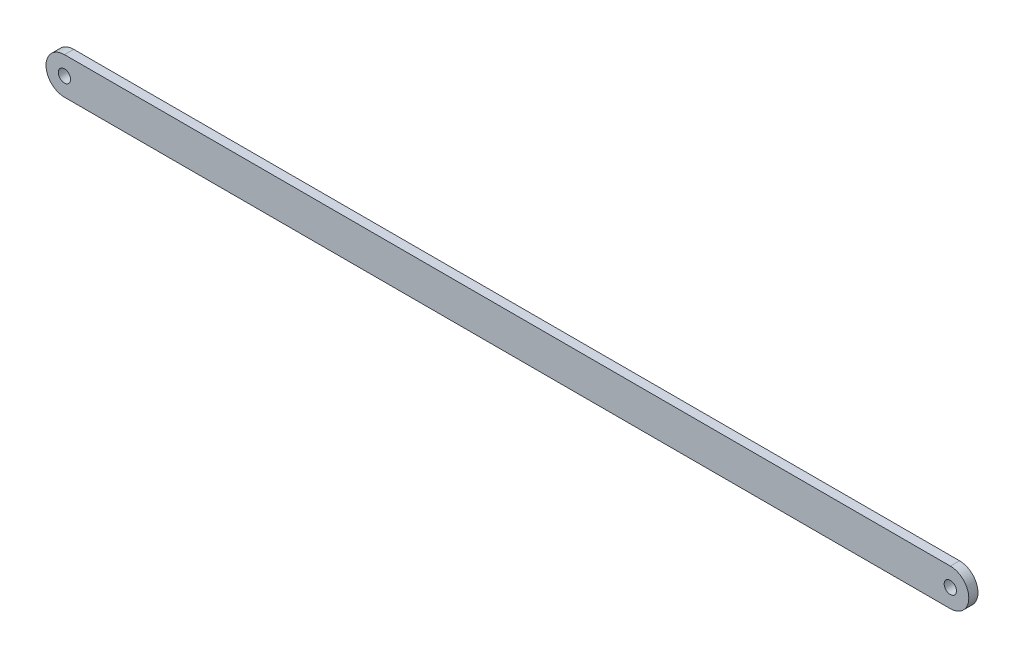
ISO-10303-21;
HEADER;
FILE_DESCRIPTION(('STEP AP214'),'2;1');
FILE_NAME('part.step','',(''),(''),'','','');
FILE_SCHEMA(('AUTOMOTIVE_DESIGN { 1 0 10303 214 1 1 1 1 }'));
ENDSEC;
DATA;
#1=APPLICATION_CONTEXT('core data for automotive mechanical design processes');
#2=APPLICATION_PROTOCOL_DEFINITION('international standard','automotive_design',2000,#1);
#3=PRODUCT_CONTEXT('',#1,'mechanical');
#4=PRODUCT('Part','Part','',(#3));
#5=PRODUCT_RELATED_PRODUCT_CATEGORY('part','',(#4));
#6=PRODUCT_DEFINITION_FORMATION('','',#4);
#7=PRODUCT_DEFINITION_CONTEXT('part definition',#1,'design');
#8=PRODUCT_DEFINITION('design','',#6,#7);
#9=PRODUCT_DEFINITION_SHAPE('','',#8);
#10=(LENGTH_UNIT() NAMED_UNIT(*) SI_UNIT(.MILLI.,.METRE.));
#11=(NAMED_UNIT(*) PLANE_ANGLE_UNIT() SI_UNIT($,.RADIAN.));
#12=(NAMED_UNIT(*) SI_UNIT($,.STERADIAN.) SOLID_ANGLE_UNIT());
#13=UNCERTAINTY_MEASURE_WITH_UNIT(LENGTH_MEASURE(1.E-05),#10,'distance_accuracy_value','');
#14=(GEOMETRIC_REPRESENTATION_CONTEXT(3) GLOBAL_UNCERTAINTY_ASSIGNED_CONTEXT((#13)) GLOBAL_UNIT_ASSIGNED_CONTEXT((#10,
#11,#12)) REPRESENTATION_CONTEXT('',''));
#15=CARTESIAN_POINT('',(0.,0.,0.));
#16=DIRECTION('',(0.,0.,1.));
#17=DIRECTION('',(1.,0.,0.));
#18=AXIS2_PLACEMENT_3D('',#15,#16,#17);
#19=CARTESIAN_POINT('',(-35.3127241673783,0.,3.));
#20=DIRECTION('',(0.,0.,1.));
#21=DIRECTION('',(1.,0.,0.));
#22=AXIS2_PLACEMENT_3D('',#19,#20,#21);
#23=PLANE('',#22);
#24=CARTESIAN_POINT('',(-35.3127241673783,0.,3.));
#25=DIRECTION('',(0.,0.,1.));
#26=DIRECTION('',(1.,0.,0.));
#27=AXIS2_PLACEMENT_3D('',#24,#25,#26);
#28=CIRCLE('',#27,2.);
#29=CARTESIAN_POINT('',(-33.3127241673783,0.,3.));
#30=VERTEX_POINT('',#29);
#31=EDGE_CURVE('E100',#30,#30,#28,.T.);
#32=ORIENTED_EDGE('',*,*,#31,.F.);
#33=EDGE_LOOP('',(#32));
#34=FACE_BOUND('',#33,.T.);
#35=CARTESIAN_POINT('',(-35.3127241673783,0.,3.));
#36=DIRECTION('',(0.,0.,1.));
#37=DIRECTION('',(1.,0.,0.));
#38=AXIS2_PLACEMENT_3D('',#35,#36,#37);
#39=CIRCLE('',#38,6.);
#40=CARTESIAN_POINT('',(-35.3127241673783,6.,3.));
#41=VERTEX_POINT('',#40);
#42=CARTESIAN_POINT('',(-35.3127241673783,-6.,3.));
#43=VERTEX_POINT('',#42);
#44=EDGE_CURVE('E85',#41,#43,#39,.T.);
#45=ORIENTED_EDGE('',*,*,#44,.T.);
#46=DIRECTION('',(1.,0.,0.));
#47=VECTOR('',#46,1.);
#48=CARTESIAN_POINT('',(-35.3127241673783,-6.,3.));
#49=LINE('',#48,#47);
#50=CARTESIAN_POINT('',(252.687275832622,-6.,3.));
#51=VERTEX_POINT('',#50);
#52=EDGE_CURVE('E80',#43,#51,#49,.T.);
#53=ORIENTED_EDGE('',*,*,#52,.T.);
#54=CARTESIAN_POINT('',(252.687275832622,0.,3.));
#55=DIRECTION('',(0.,0.,1.));
#56=DIRECTION('',(1.,0.,0.));
#57=AXIS2_PLACEMENT_3D('',#54,#55,#56);
#58=CIRCLE('',#57,6.);
#59=CARTESIAN_POINT('',(252.687275832622,6.,3.));
#60=VERTEX_POINT('',#59);
#61=EDGE_CURVE('E83',#51,#60,#58,.T.);
#62=ORIENTED_EDGE('',*,*,#61,.T.);
#63=DIRECTION('',(-1.,0.,0.));
#64=VECTOR('',#63,1.);
#65=CARTESIAN_POINT('',(-35.3127241673783,6.,3.));
#66=LINE('',#65,#64);
#67=EDGE_CURVE('E50',#60,#41,#66,.T.);
#68=ORIENTED_EDGE('',*,*,#67,.T.);
#69=EDGE_LOOP('',(#45,#53,#62,#68));
#70=FACE_BOUND('',#69,.T.);
#71=CARTESIAN_POINT('',(252.687275832622,0.,3.));
#72=DIRECTION('',(0.,0.,1.));
#73=DIRECTION('',(1.,0.,0.));
#74=AXIS2_PLACEMENT_3D('',#71,#72,#73);
#75=CIRCLE('',#74,2.);
#76=CARTESIAN_POINT('',(254.687275832622,0.,3.));
#77=VERTEX_POINT('',#76);
#78=EDGE_CURVE('E115',#77,#77,#75,.T.);
#79=ORIENTED_EDGE('',*,*,#78,.F.);
#80=EDGE_LOOP('',(#79));
#81=FACE_BOUND('',#80,.T.);
#82=ADVANCED_FACE('F33',(#34,#70,#81),#23,.T.);
#83=CARTESIAN_POINT('',(-35.3127241673783,0.,0.));
#84=DIRECTION('',(0.,0.,1.));
#85=DIRECTION('',(1.,0.,0.));
#86=AXIS2_PLACEMENT_3D('',#83,#84,#85);
#87=PLANE('',#86);
#88=CARTESIAN_POINT('',(-35.3127241673783,0.,0.));
#89=DIRECTION('',(0.,0.,1.));
#90=DIRECTION('',(1.,0.,0.));
#91=AXIS2_PLACEMENT_3D('',#88,#89,#90);
#92=CIRCLE('',#91,2.);
#93=CARTESIAN_POINT('',(-33.3127241673783,0.,0.));
#94=VERTEX_POINT('',#93);
#95=EDGE_CURVE('E112',#94,#94,#92,.T.);
#96=ORIENTED_EDGE('',*,*,#95,.T.);
#97=EDGE_LOOP('',(#96));
#98=FACE_BOUND('',#97,.T.);
#99=CARTESIAN_POINT('',(-35.3127241673783,0.,0.));
#100=DIRECTION('',(0.,0.,1.));
#101=DIRECTION('',(1.,0.,0.));
#102=AXIS2_PLACEMENT_3D('',#99,#100,#101);
#103=CIRCLE('',#102,6.);
#104=CARTESIAN_POINT('',(-35.3127241673783,6.,0.));
#105=VERTEX_POINT('',#104);
#106=CARTESIAN_POINT('',(-35.3127241673783,-6.,0.));
#107=VERTEX_POINT('',#106);
#108=EDGE_CURVE('E97',#105,#107,#103,.T.);
#109=ORIENTED_EDGE('',*,*,#108,.F.);
#110=DIRECTION('',(-1.,0.,0.));
#111=VECTOR('',#110,1.);
#112=CARTESIAN_POINT('',(-35.3127241673783,6.,0.));
#113=LINE('',#112,#111);
#114=CARTESIAN_POINT('',(252.687275832622,6.,0.));
#115=VERTEX_POINT('',#114);
#116=EDGE_CURVE('E73',#115,#105,#113,.T.);
#117=ORIENTED_EDGE('',*,*,#116,.F.);
#118=CARTESIAN_POINT('',(252.687275832622,0.,0.));
#119=DIRECTION('',(0.,0.,1.));
#120=DIRECTION('',(1.,0.,0.));
#121=AXIS2_PLACEMENT_3D('',#118,#119,#120);
#122=CIRCLE('',#121,6.);
#123=CARTESIAN_POINT('',(252.687275832622,-6.,0.));
#124=VERTEX_POINT('',#123);
#125=EDGE_CURVE('E67',#124,#115,#122,.T.);
#126=ORIENTED_EDGE('',*,*,#125,.F.);
#127=DIRECTION('',(1.,0.,0.));
#128=VECTOR('',#127,1.);
#129=CARTESIAN_POINT('',(-35.3127241673783,-6.,0.));
#130=LINE('',#129,#128);
#131=EDGE_CURVE('E89',#107,#124,#130,.T.);
#132=ORIENTED_EDGE('',*,*,#131,.F.);
#133=EDGE_LOOP('',(#109,#117,#126,#132));
#134=FACE_BOUND('',#133,.T.);
#135=CARTESIAN_POINT('',(252.687275832622,0.,0.));
#136=DIRECTION('',(0.,0.,1.));
#137=DIRECTION('',(1.,0.,0.));
#138=AXIS2_PLACEMENT_3D('',#135,#136,#137);
#139=CIRCLE('',#138,2.);
#140=CARTESIAN_POINT('',(254.687275832622,0.,0.));
#141=VERTEX_POINT('',#140);
#142=EDGE_CURVE('E118',#141,#141,#139,.T.);
#143=ORIENTED_EDGE('',*,*,#142,.T.);
#144=EDGE_LOOP('',(#143));
#145=FACE_BOUND('',#144,.T.);
#146=ADVANCED_FACE('F108',(#98,#134,#145),#87,.F.);
#147=CARTESIAN_POINT('',(-35.3127241673783,0.,3.));
#148=DIRECTION('',(0.,0.,-1.));
#149=DIRECTION('',(-1.,0.,0.));
#150=AXIS2_PLACEMENT_3D('',#147,#148,#149);
#151=CYLINDRICAL_SURFACE('',#150,6.);
#152=ORIENTED_EDGE('',*,*,#108,.T.);
#153=DIRECTION('',(0.,0.,-1.));
#154=VECTOR('',#153,1.);
#155=CARTESIAN_POINT('',(-35.3127241673783,-6.,3.));
#156=LINE('',#155,#154);
#157=EDGE_CURVE('E11',#43,#107,#156,.T.);
#158=ORIENTED_EDGE('',*,*,#157,.F.);
#159=ORIENTED_EDGE('',*,*,#44,.F.);
#160=DIRECTION('',(0.,0.,-1.));
#161=VECTOR('',#160,1.);
#162=CARTESIAN_POINT('',(-35.3127241673783,6.,3.));
#163=LINE('',#162,#161);
#164=EDGE_CURVE('E93',#41,#105,#163,.T.);
#165=ORIENTED_EDGE('',*,*,#164,.T.);
#166=EDGE_LOOP('',(#152,#158,#159,#165));
#167=FACE_BOUND('',#166,.T.);
#168=ADVANCED_FACE('F35',(#167),#151,.T.);
#169=CARTESIAN_POINT('',(-35.3127241673783,-6.,3.));
#170=DIRECTION('',(0.,1.,0.));
#171=DIRECTION('',(0.,0.,1.));
#172=AXIS2_PLACEMENT_3D('',#169,#170,#171);
#173=PLANE('',#172);
#174=ORIENTED_EDGE('',*,*,#131,.T.);
#175=DIRECTION('',(0.,0.,-1.));
#176=VECTOR('',#175,1.);
#177=CARTESIAN_POINT('',(252.687275832622,-6.,3.));
#178=LINE('',#177,#176);
#179=EDGE_CURVE('E42',#51,#124,#178,.T.);
#180=ORIENTED_EDGE('',*,*,#179,.F.);
#181=ORIENTED_EDGE('',*,*,#52,.F.);
#182=ORIENTED_EDGE('',*,*,#157,.T.);
#183=EDGE_LOOP('',(#174,#180,#181,#182));
#184=FACE_BOUND('',#183,.T.);
#185=ADVANCED_FACE('F88',(#184),#173,.F.);
#186=CARTESIAN_POINT('',(252.687275832622,0.,3.));
#187=DIRECTION('',(0.,0.,-1.));
#188=DIRECTION('',(-1.,0.,0.));
#189=AXIS2_PLACEMENT_3D('',#186,#187,#188);
#190=CYLINDRICAL_SURFACE('',#189,6.);
#191=ORIENTED_EDGE('',*,*,#125,.T.);
#192=DIRECTION('',(0.,0.,-1.));
#193=VECTOR('',#192,1.);
#194=CARTESIAN_POINT('',(252.687275832622,6.,3.));
#195=LINE('',#194,#193);
#196=EDGE_CURVE('E90',#60,#115,#195,.T.);
#197=ORIENTED_EDGE('',*,*,#196,.F.);
#198=ORIENTED_EDGE('',*,*,#61,.F.);
#199=ORIENTED_EDGE('',*,*,#179,.T.);
#200=EDGE_LOOP('',(#191,#197,#198,#199));
#201=FACE_BOUND('',#200,.T.);
#202=ADVANCED_FACE('F91',(#201),#190,.T.);
#203=CARTESIAN_POINT('',(-35.3127241673783,6.,3.));
#204=DIRECTION('',(0.,-1.,0.));
#205=DIRECTION('',(0.,0.,-1.));
#206=AXIS2_PLACEMENT_3D('',#203,#204,#205);
#207=PLANE('',#206);
#208=ORIENTED_EDGE('',*,*,#116,.T.);
#209=ORIENTED_EDGE('',*,*,#164,.F.);
#210=ORIENTED_EDGE('',*,*,#67,.F.);
#211=ORIENTED_EDGE('',*,*,#196,.T.);
#212=EDGE_LOOP('',(#208,#209,#210,#211));
#213=FACE_BOUND('',#212,.T.);
#214=ADVANCED_FACE('F105',(#213),#207,.F.);
#215=CARTESIAN_POINT('',(-35.3127241673783,0.,3.));
#216=DIRECTION('',(0.,0.,-1.));
#217=DIRECTION('',(-1.,0.,0.));
#218=AXIS2_PLACEMENT_3D('',#215,#216,#217);
#219=CYLINDRICAL_SURFACE('',#218,2.);
#220=ORIENTED_EDGE('',*,*,#31,.T.);
#221=EDGE_LOOP('',(#220));
#222=FACE_BOUND('',#221,.T.);
#223=ORIENTED_EDGE('',*,*,#95,.F.);
#224=EDGE_LOOP('',(#223));
#225=FACE_BOUND('',#224,.T.);
#226=ADVANCED_FACE('F136',(#222,#225),#219,.F.);
#227=CARTESIAN_POINT('',(252.687275832622,0.,3.));
#228=DIRECTION('',(0.,0.,-1.));
#229=DIRECTION('',(-1.,0.,0.));
#230=AXIS2_PLACEMENT_3D('',#227,#228,#229);
#231=CYLINDRICAL_SURFACE('',#230,2.);
#232=ORIENTED_EDGE('',*,*,#78,.T.);
#233=EDGE_LOOP('',(#232));
#234=FACE_BOUND('',#233,.T.);
#235=ORIENTED_EDGE('',*,*,#142,.F.);
#236=EDGE_LOOP('',(#235));
#237=FACE_BOUND('',#236,.T.);
#238=ADVANCED_FACE('F124',(#234,#237),#231,.F.);
#239=CLOSED_SHELL('',(#82,#146,#168,#185,#202,#214,#226,#238));
#240=MANIFOLD_SOLID_BREP('B2',#239);
#241=ADVANCED_BREP_SHAPE_REPRESENTATION('',(#18,#240),#14);
#242=SHAPE_DEFINITION_REPRESENTATION(#9,#241);
ENDSEC;
END-ISO-10303-21;
